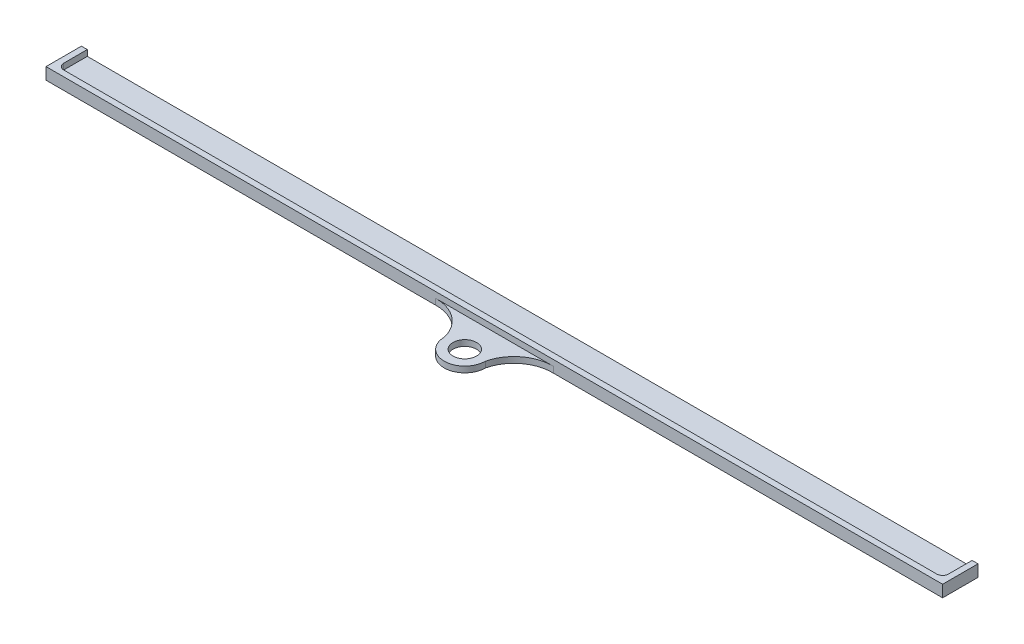
ISO-10303-21;
HEADER;
FILE_DESCRIPTION(('STEP AP214'),'2;1');
FILE_NAME('part.step','',(''),(''),'','','');
FILE_SCHEMA(('AUTOMOTIVE_DESIGN { 1 0 10303 214 1 1 1 1 }'));
ENDSEC;
DATA;
#1=APPLICATION_CONTEXT('core data for automotive mechanical design processes');
#2=APPLICATION_PROTOCOL_DEFINITION('international standard','automotive_design',2000,#1);
#3=PRODUCT_CONTEXT('',#1,'mechanical');
#4=PRODUCT('Part','Part','',(#3));
#5=PRODUCT_RELATED_PRODUCT_CATEGORY('part','',(#4));
#6=PRODUCT_DEFINITION_FORMATION('','',#4);
#7=PRODUCT_DEFINITION_CONTEXT('part definition',#1,'design');
#8=PRODUCT_DEFINITION('design','',#6,#7);
#9=PRODUCT_DEFINITION_SHAPE('','',#8);
#10=(LENGTH_UNIT() NAMED_UNIT(*) SI_UNIT(.MILLI.,.METRE.));
#11=(NAMED_UNIT(*) PLANE_ANGLE_UNIT() SI_UNIT($,.RADIAN.));
#12=(NAMED_UNIT(*) SI_UNIT($,.STERADIAN.) SOLID_ANGLE_UNIT());
#13=UNCERTAINTY_MEASURE_WITH_UNIT(LENGTH_MEASURE(1.E-05),#10,'distance_accuracy_value','');
#14=(GEOMETRIC_REPRESENTATION_CONTEXT(3) GLOBAL_UNCERTAINTY_ASSIGNED_CONTEXT((#13)) GLOBAL_UNIT_ASSIGNED_CONTEXT((#10,
#11,#12)) REPRESENTATION_CONTEXT('',''));
#15=CARTESIAN_POINT('',(0.,0.,0.));
#16=DIRECTION('',(0.,0.,1.));
#17=DIRECTION('',(1.,0.,0.));
#18=AXIS2_PLACEMENT_3D('',#15,#16,#17);
#19=CARTESIAN_POINT('',(0.,0.,0.));
#20=DIRECTION('',(0.,1.,0.));
#21=DIRECTION('',(0.,0.,1.));
#22=AXIS2_PLACEMENT_3D('',#19,#20,#21);
#23=PLANE('',#22);
#24=DIRECTION('',(0.,0.,-1.));
#25=VECTOR('',#24,1.);
#26=CARTESIAN_POINT('',(-150.,0.,-5.99999999999999));
#27=LINE('',#26,#25);
#28=CARTESIAN_POINT('',(-150.,0.,2.));
#29=VERTEX_POINT('',#28);
#30=CARTESIAN_POINT('',(-150.,0.,-5.99999999999999));
#31=VERTEX_POINT('',#30);
#32=EDGE_CURVE('E61',#29,#31,#27,.T.);
#33=ORIENTED_EDGE('',*,*,#32,.F.);
#34=CARTESIAN_POINT('',(-148.,0.,2.00000000000001));
#35=DIRECTION('',(0.,-1.,0.));
#36=DIRECTION('',(0.,0.,-1.));
#37=AXIS2_PLACEMENT_3D('',#34,#35,#36);
#38=CIRCLE('',#37,2.);
#39=CARTESIAN_POINT('',(-148.,0.,4.00000000000001));
#40=VERTEX_POINT('',#39);
#41=EDGE_CURVE('E65',#40,#29,#38,.T.);
#42=ORIENTED_EDGE('',*,*,#41,.F.);
#43=DIRECTION('',(-1.,0.,0.));
#44=VECTOR('',#43,1.);
#45=CARTESIAN_POINT('',(-148.,0.,4.00000000000001));
#46=LINE('',#45,#44);
#47=CARTESIAN_POINT('',(148.,0.,3.99999999999997));
#48=VERTEX_POINT('',#47);
#49=EDGE_CURVE('E353',#48,#40,#46,.T.);
#50=ORIENTED_EDGE('',*,*,#49,.F.);
#51=CARTESIAN_POINT('',(148.,0.,1.99999999999997));
#52=DIRECTION('',(0.,-1.,0.));
#53=DIRECTION('',(0.,0.,1.));
#54=AXIS2_PLACEMENT_3D('',#51,#52,#53);
#55=CIRCLE('',#54,2.);
#56=CARTESIAN_POINT('',(150.,0.,1.99999999999996));
#57=VERTEX_POINT('',#56);
#58=EDGE_CURVE('E354',#57,#48,#55,.T.);
#59=ORIENTED_EDGE('',*,*,#58,.F.);
#60=DIRECTION('',(0.,0.,1.));
#61=VECTOR('',#60,1.);
#62=CARTESIAN_POINT('',(150.,0.,-5.99999999999999));
#63=LINE('',#62,#61);
#64=CARTESIAN_POINT('',(150.,0.,-5.99999999999999));
#65=VERTEX_POINT('',#64);
#66=EDGE_CURVE('E197',#65,#57,#63,.T.);
#67=ORIENTED_EDGE('',*,*,#66,.F.);
#68=DIRECTION('',(1.,0.,0.));
#69=VECTOR('',#68,1.);
#70=CARTESIAN_POINT('',(0.,0.,-5.99999999999999));
#71=LINE('',#70,#69);
#72=EDGE_CURVE('E208',#31,#65,#71,.T.);
#73=ORIENTED_EDGE('',*,*,#72,.F.);
#74=EDGE_LOOP('',(#33,#42,#50,#59,#67,#73));
#75=FACE_BOUND('',#74,.T.);
#76=ADVANCED_FACE('F41',(#75),#23,.T.);
#77=CARTESIAN_POINT('',(-19.6502259153962,-2.,18.9952936900149));
#78=DIRECTION('',(0.,1.,0.));
#79=DIRECTION('',(0.,0.,1.));
#80=AXIS2_PLACEMENT_3D('',#77,#78,#79);
#81=CYLINDRICAL_SURFACE('',#80,13.);
#82=CARTESIAN_POINT('',(-19.9999999999999,0.,6.00000000000001));
#83=DIRECTION('',(1.,0.,0.));
#84=VECTOR('',#83,1.);
#85=LINE('',#82,#84);
#86=CARTESIAN_POINT('',(-20.,0.,6.00000000000001));
#87=VERTEX_POINT('',#86);
#88=CARTESIAN_POINT('',(-19.3004518307924,0.,6.00000000000001));
#89=VERTEX_POINT('',#88);
#90=EDGE_CURVE('E222',#87,#89,#85,.T.);
#91=ORIENTED_EDGE('',*,*,#90,.F.);
#92=DIRECTION('',(0.,1.,0.));
#93=VECTOR('',#92,1.);
#94=CARTESIAN_POINT('',(-20.,-2.,6.00000000000001));
#95=LINE('',#94,#93);
#96=CARTESIAN_POINT('',(-20.,-2.,6.00000000000001));
#97=VERTEX_POINT('',#96);
#98=EDGE_CURVE('E53',#97,#87,#95,.T.);
#99=ORIENTED_EDGE('',*,*,#98,.F.);
#100=CARTESIAN_POINT('',(-19.6502259153962,-2.,18.9952936900149));
#101=DIRECTION('',(0.,1.,0.));
#102=DIRECTION('',(0.,0.,1.));
#103=AXIS2_PLACEMENT_3D('',#100,#101,#102);
#104=CIRCLE('',#103,13.);
#105=CARTESIAN_POINT('',(-7.00000000000014,-2.,16.));
#106=VERTEX_POINT('',#105);
#107=EDGE_CURVE('E299',#97,#106,#104,.F.);
#108=ORIENTED_EDGE('',*,*,#107,.T.);
#109=DIRECTION('',(0.,1.,0.));
#110=VECTOR('',#109,1.);
#111=CARTESIAN_POINT('',(-7.00000000000014,-2.,16.));
#112=LINE('',#111,#110);
#113=CARTESIAN_POINT('',(-7.00000000000014,0.,16.));
#114=VERTEX_POINT('',#113);
#115=EDGE_CURVE('E313',#106,#114,#112,.T.);
#116=ORIENTED_EDGE('',*,*,#115,.T.);
#117=CARTESIAN_POINT('',(-19.6502259153962,0.,18.9952936900149));
#118=DIRECTION('',(0.,1.,0.));
#119=DIRECTION('',(0.,0.,1.));
#120=AXIS2_PLACEMENT_3D('',#117,#118,#119);
#121=CIRCLE('',#120,13.);
#122=EDGE_CURVE('E234',#89,#114,#121,.F.);
#123=ORIENTED_EDGE('',*,*,#122,.F.);
#124=EDGE_LOOP('',(#91,#99,#108,#116,#123));
#125=FACE_BOUND('',#124,.T.);
#126=ADVANCED_FACE('F43',(#125),#81,.F.);
#127=CARTESIAN_POINT('',(0.,-2.,6.00000000000001));
#128=DIRECTION('',(0.,0.,1.));
#129=DIRECTION('',(1.,0.,0.));
#130=AXIS2_PLACEMENT_3D('',#127,#128,#129);
#131=PLANE('',#130);
#132=ORIENTED_EDGE('',*,*,#98,.T.);
#133=ORIENTED_EDGE('',*,*,#90,.T.);
#134=DIRECTION('',(1.,0.,0.));
#135=VECTOR('',#134,1.);
#136=CARTESIAN_POINT('',(-152.,0.,6.00000000000001));
#137=LINE('',#136,#135);
#138=CARTESIAN_POINT('',(19.300451830792,0.,6.00000000000001));
#139=VERTEX_POINT('',#138);
#140=EDGE_CURVE('E11',#89,#139,#137,.T.);
#141=ORIENTED_EDGE('',*,*,#140,.T.);
#142=CARTESIAN_POINT('',(19.300451830792,0.,6.00000000000001));
#143=DIRECTION('',(1.,0.,0.));
#144=VECTOR('',#143,1.);
#145=LINE('',#142,#144);
#146=CARTESIAN_POINT('',(19.9999999999999,0.,6.00000000000001));
#147=VERTEX_POINT('',#146);
#148=EDGE_CURVE('E209',#139,#147,#145,.T.);
#149=ORIENTED_EDGE('',*,*,#148,.T.);
#150=DIRECTION('',(0.,1.,0.));
#151=VECTOR('',#150,1.);
#152=CARTESIAN_POINT('',(19.9999999999999,-2.,6.00000000000001));
#153=LINE('',#152,#151);
#154=CARTESIAN_POINT('',(19.9999999999999,-2.,6.00000000000001));
#155=VERTEX_POINT('',#154);
#156=EDGE_CURVE('E212',#155,#147,#153,.T.);
#157=ORIENTED_EDGE('',*,*,#156,.F.);
#158=DIRECTION('',(1.,0.,0.));
#159=VECTOR('',#158,1.);
#160=CARTESIAN_POINT('',(0.,-2.,6.00000000000001));
#161=LINE('',#160,#159);
#162=CARTESIAN_POINT('',(152.,-2.,6.00000000000001));
#163=VERTEX_POINT('',#162);
#164=EDGE_CURVE('E330',#155,#163,#161,.T.);
#165=ORIENTED_EDGE('',*,*,#164,.T.);
#166=DIRECTION('',(0.,1.,0.));
#167=VECTOR('',#166,1.);
#168=CARTESIAN_POINT('',(152.,-2.,6.00000000000001));
#169=LINE('',#168,#167);
#170=CARTESIAN_POINT('',(152.,2.,6.00000000000001));
#171=VERTEX_POINT('',#170);
#172=EDGE_CURVE('E167',#163,#171,#169,.T.);
#173=ORIENTED_EDGE('',*,*,#172,.T.);
#174=DIRECTION('',(1.,0.,0.));
#175=VECTOR('',#174,1.);
#176=CARTESIAN_POINT('',(-152.,2.,6.00000000000001));
#177=LINE('',#176,#175);
#178=CARTESIAN_POINT('',(-152.,2.,6.00000000000001));
#179=VERTEX_POINT('',#178);
#180=EDGE_CURVE('E164',#179,#171,#177,.T.);
#181=ORIENTED_EDGE('',*,*,#180,.F.);
#182=DIRECTION('',(0.,1.,0.));
#183=VECTOR('',#182,1.);
#184=CARTESIAN_POINT('',(-152.,-2.,6.00000000000001));
#185=LINE('',#184,#183);
#186=CARTESIAN_POINT('',(-152.,-2.,6.00000000000001));
#187=VERTEX_POINT('',#186);
#188=EDGE_CURVE('E151',#187,#179,#185,.T.);
#189=ORIENTED_EDGE('',*,*,#188,.F.);
#190=EDGE_CURVE('E323',#187,#97,#161,.T.);
#191=ORIENTED_EDGE('',*,*,#190,.T.);
#192=EDGE_LOOP('',(#132,#133,#141,#149,#157,#165,#173,#181,#189,#191));
#193=FACE_BOUND('',#192,.T.);
#194=ADVANCED_FACE('F165',(#193),#131,.T.);
#195=CARTESIAN_POINT('',(-152.,-2.,0.));
#196=DIRECTION('',(1.,0.,0.));
#197=DIRECTION('',(0.,0.,-1.));
#198=AXIS2_PLACEMENT_3D('',#195,#196,#197);
#199=PLANE('',#198);
#200=ORIENTED_EDGE('',*,*,#188,.T.);
#201=DIRECTION('',(0.,0.,1.));
#202=VECTOR('',#201,1.);
#203=CARTESIAN_POINT('',(-152.,2.,-5.99999999999999));
#204=LINE('',#203,#202);
#205=CARTESIAN_POINT('',(-152.,2.,-5.99999999999999));
#206=VERTEX_POINT('',#205);
#207=EDGE_CURVE('E156',#206,#179,#204,.T.);
#208=ORIENTED_EDGE('',*,*,#207,.F.);
#209=DIRECTION('',(0.,1.,0.));
#210=VECTOR('',#209,1.);
#211=CARTESIAN_POINT('',(-152.,-2.,-5.99999999999999));
#212=LINE('',#211,#210);
#213=CARTESIAN_POINT('',(-152.,-2.,-5.99999999999999));
#214=VERTEX_POINT('',#213);
#215=EDGE_CURVE('E161',#214,#206,#212,.T.);
#216=ORIENTED_EDGE('',*,*,#215,.F.);
#217=DIRECTION('',(0.,0.,-1.));
#218=VECTOR('',#217,1.);
#219=CARTESIAN_POINT('',(-152.,-2.,0.));
#220=LINE('',#219,#218);
#221=EDGE_CURVE('E157',#187,#214,#220,.T.);
#222=ORIENTED_EDGE('',*,*,#221,.F.);
#223=EDGE_LOOP('',(#200,#208,#216,#222));
#224=FACE_BOUND('',#223,.T.);
#225=ADVANCED_FACE('F153',(#224),#199,.F.);
#226=CARTESIAN_POINT('',(0.,-2.,-5.99999999999999));
#227=DIRECTION('',(0.,0.,1.));
#228=DIRECTION('',(1.,0.,0.));
#229=AXIS2_PLACEMENT_3D('',#226,#227,#228);
#230=PLANE('',#229);
#231=ORIENTED_EDGE('',*,*,#215,.T.);
#232=DIRECTION('',(-1.,0.,0.));
#233=VECTOR('',#232,1.);
#234=CARTESIAN_POINT('',(-150.,2.,-5.99999999999999));
#235=LINE('',#234,#233);
#236=CARTESIAN_POINT('',(-150.,2.,-5.99999999999999));
#237=VERTEX_POINT('',#236);
#238=EDGE_CURVE('E176',#237,#206,#235,.T.);
#239=ORIENTED_EDGE('',*,*,#238,.F.);
#240=DIRECTION('',(0.,-1.,0.));
#241=VECTOR('',#240,1.);
#242=CARTESIAN_POINT('',(-150.,2.,-5.99999999999999));
#243=LINE('',#242,#241);
#244=EDGE_CURVE('E194',#237,#31,#243,.T.);
#245=ORIENTED_EDGE('',*,*,#244,.T.);
#246=ORIENTED_EDGE('',*,*,#72,.T.);
#247=DIRECTION('',(0.,-1.,0.));
#248=VECTOR('',#247,1.);
#249=CARTESIAN_POINT('',(150.,2.,-5.99999999999999));
#250=LINE('',#249,#248);
#251=CARTESIAN_POINT('',(150.,2.,-5.99999999999999));
#252=VERTEX_POINT('',#251);
#253=EDGE_CURVE('E236',#252,#65,#250,.T.);
#254=ORIENTED_EDGE('',*,*,#253,.F.);
#255=DIRECTION('',(-1.,0.,0.));
#256=VECTOR('',#255,1.);
#257=CARTESIAN_POINT('',(152.,2.,-5.99999999999999));
#258=LINE('',#257,#256);
#259=CARTESIAN_POINT('',(152.,2.,-5.99999999999999));
#260=VERTEX_POINT('',#259);
#261=EDGE_CURVE('E181',#260,#252,#258,.T.);
#262=ORIENTED_EDGE('',*,*,#261,.F.);
#263=DIRECTION('',(0.,1.,0.));
#264=VECTOR('',#263,1.);
#265=CARTESIAN_POINT('',(152.,-2.,-5.99999999999999));
#266=LINE('',#265,#264);
#267=CARTESIAN_POINT('',(152.,-2.,-5.99999999999999));
#268=VERTEX_POINT('',#267);
#269=EDGE_CURVE('E309',#268,#260,#266,.T.);
#270=ORIENTED_EDGE('',*,*,#269,.F.);
#271=DIRECTION('',(1.,0.,0.));
#272=VECTOR('',#271,1.);
#273=CARTESIAN_POINT('',(0.,-2.,-5.99999999999999));
#274=LINE('',#273,#272);
#275=EDGE_CURVE('E325',#214,#268,#274,.T.);
#276=ORIENTED_EDGE('',*,*,#275,.F.);
#277=EDGE_LOOP('',(#231,#239,#245,#246,#254,#262,#270,#276));
#278=FACE_BOUND('',#277,.T.);
#279=ADVANCED_FACE('F257',(#278),#230,.F.);
#280=CARTESIAN_POINT('',(152.,-2.,0.));
#281=DIRECTION('',(1.,0.,0.));
#282=DIRECTION('',(0.,0.,-1.));
#283=AXIS2_PLACEMENT_3D('',#280,#281,#282);
#284=PLANE('',#283);
#285=ORIENTED_EDGE('',*,*,#269,.T.);
#286=DIRECTION('',(0.,0.,-1.));
#287=VECTOR('',#286,1.);
#288=CARTESIAN_POINT('',(152.,2.,6.00000000000001));
#289=LINE('',#288,#287);
#290=EDGE_CURVE('E171',#171,#260,#289,.T.);
#291=ORIENTED_EDGE('',*,*,#290,.F.);
#292=ORIENTED_EDGE('',*,*,#172,.F.);
#293=DIRECTION('',(0.,0.,-1.));
#294=VECTOR('',#293,1.);
#295=CARTESIAN_POINT('',(152.,-2.,0.));
#296=LINE('',#295,#294);
#297=EDGE_CURVE('E327',#163,#268,#296,.T.);
#298=ORIENTED_EDGE('',*,*,#297,.T.);
#299=EDGE_LOOP('',(#285,#291,#292,#298));
#300=FACE_BOUND('',#299,.T.);
#301=ADVANCED_FACE('F260',(#300),#284,.T.);
#302=CARTESIAN_POINT('',(19.6502259153959,-2.,18.9952936900148));
#303=DIRECTION('',(0.,1.,0.));
#304=DIRECTION('',(0.,0.,1.));
#305=AXIS2_PLACEMENT_3D('',#302,#303,#304);
#306=CYLINDRICAL_SURFACE('',#305,13.);
#307=CARTESIAN_POINT('',(19.6502259153959,0.,18.9952936900148));
#308=DIRECTION('',(0.,1.,0.));
#309=DIRECTION('',(0.,0.,1.));
#310=AXIS2_PLACEMENT_3D('',#307,#308,#309);
#311=CIRCLE('',#310,13.);
#312=CARTESIAN_POINT('',(6.99999999999986,0.,16.));
#313=VERTEX_POINT('',#312);
#314=EDGE_CURVE('E205',#313,#139,#311,.F.);
#315=ORIENTED_EDGE('',*,*,#314,.F.);
#316=DIRECTION('',(0.,1.,0.));
#317=VECTOR('',#316,1.);
#318=CARTESIAN_POINT('',(6.99999999999986,-2.,16.));
#319=LINE('',#318,#317);
#320=CARTESIAN_POINT('',(6.99999999999986,-2.,16.));
#321=VERTEX_POINT('',#320);
#322=EDGE_CURVE('E214',#321,#313,#319,.T.);
#323=ORIENTED_EDGE('',*,*,#322,.F.);
#324=CARTESIAN_POINT('',(19.6502259153959,-2.,18.9952936900148));
#325=DIRECTION('',(0.,1.,0.));
#326=DIRECTION('',(0.,0.,1.));
#327=AXIS2_PLACEMENT_3D('',#324,#325,#326);
#328=CIRCLE('',#327,13.);
#329=EDGE_CURVE('E332',#321,#155,#328,.F.);
#330=ORIENTED_EDGE('',*,*,#329,.T.);
#331=ORIENTED_EDGE('',*,*,#156,.T.);
#332=ORIENTED_EDGE('',*,*,#148,.F.);
#333=EDGE_LOOP('',(#315,#323,#330,#331,#332));
#334=FACE_BOUND('',#333,.T.);
#335=ADVANCED_FACE('F263',(#334),#306,.F.);
#336=CARTESIAN_POINT('',(-1.35308431126191E-13,-2.,16.));
#337=DIRECTION('',(0.,1.,0.));
#338=DIRECTION('',(0.,0.,1.));
#339=AXIS2_PLACEMENT_3D('',#336,#337,#338);
#340=CYLINDRICAL_SURFACE('',#339,7.);
#341=CARTESIAN_POINT('',(-1.35308431126191E-13,0.,16.));
#342=DIRECTION('',(0.,1.,0.));
#343=DIRECTION('',(0.,0.,1.));
#344=AXIS2_PLACEMENT_3D('',#341,#342,#343);
#345=CIRCLE('',#344,7.);
#346=EDGE_CURVE('E319',#114,#313,#345,.T.);
#347=ORIENTED_EDGE('',*,*,#346,.F.);
#348=ORIENTED_EDGE('',*,*,#115,.F.);
#349=CARTESIAN_POINT('',(-1.35308431126191E-13,-2.,16.));
#350=DIRECTION('',(0.,1.,0.));
#351=DIRECTION('',(0.,0.,1.));
#352=AXIS2_PLACEMENT_3D('',#349,#350,#351);
#353=CIRCLE('',#352,7.);
#354=EDGE_CURVE('E302',#106,#321,#353,.T.);
#355=ORIENTED_EDGE('',*,*,#354,.T.);
#356=ORIENTED_EDGE('',*,*,#322,.T.);
#357=EDGE_LOOP('',(#347,#348,#355,#356));
#358=FACE_BOUND('',#357,.T.);
#359=ADVANCED_FACE('F267',(#358),#340,.T.);
#360=CARTESIAN_POINT('',(-1.35308431126191E-13,-2.,16.));
#361=DIRECTION('',(0.,1.,0.));
#362=DIRECTION('',(0.,0.,1.));
#363=AXIS2_PLACEMENT_3D('',#360,#361,#362);
#364=CYLINDRICAL_SURFACE('',#363,4.);
#365=CARTESIAN_POINT('',(-1.35308431126191E-13,-2.,16.));
#366=DIRECTION('',(0.,1.,0.));
#367=DIRECTION('',(0.,0.,1.));
#368=AXIS2_PLACEMENT_3D('',#365,#366,#367);
#369=CIRCLE('',#368,4.);
#370=CARTESIAN_POINT('',(-1.35308431126191E-13,-2.,20.));
#371=VERTEX_POINT('',#370);
#372=EDGE_CURVE('E315',#371,#371,#369,.T.);
#373=ORIENTED_EDGE('',*,*,#372,.F.);
#374=EDGE_LOOP('',(#373));
#375=FACE_BOUND('',#374,.T.);
#376=CARTESIAN_POINT('',(-1.35308431126191E-13,0.,16.));
#377=DIRECTION('',(0.,1.,0.));
#378=DIRECTION('',(0.,0.,1.));
#379=AXIS2_PLACEMENT_3D('',#376,#377,#378);
#380=CIRCLE('',#379,4.);
#381=CARTESIAN_POINT('',(-1.35308431126191E-13,0.,20.));
#382=VERTEX_POINT('',#381);
#383=EDGE_CURVE('E297',#382,#382,#380,.T.);
#384=ORIENTED_EDGE('',*,*,#383,.T.);
#385=EDGE_LOOP('',(#384));
#386=FACE_BOUND('',#385,.T.);
#387=ADVANCED_FACE('F252',(#375,#386),#364,.F.);
#388=CARTESIAN_POINT('',(0.,-2.,0.));
#389=DIRECTION('',(0.,1.,0.));
#390=DIRECTION('',(0.,0.,1.));
#391=AXIS2_PLACEMENT_3D('',#388,#389,#390);
#392=PLANE('',#391);
#393=ORIENTED_EDGE('',*,*,#107,.F.);
#394=ORIENTED_EDGE('',*,*,#190,.F.);
#395=ORIENTED_EDGE('',*,*,#221,.T.);
#396=ORIENTED_EDGE('',*,*,#275,.T.);
#397=ORIENTED_EDGE('',*,*,#297,.F.);
#398=ORIENTED_EDGE('',*,*,#164,.F.);
#399=ORIENTED_EDGE('',*,*,#329,.F.);
#400=ORIENTED_EDGE('',*,*,#354,.F.);
#401=EDGE_LOOP('',(#393,#394,#395,#396,#397,#398,#399,#400));
#402=FACE_BOUND('',#401,.T.);
#403=ORIENTED_EDGE('',*,*,#372,.T.);
#404=EDGE_LOOP('',(#403));
#405=FACE_BOUND('',#404,.T.);
#406=ADVANCED_FACE('F274',(#402,#405),#392,.F.);
#407=ORIENTED_EDGE('',*,*,#140,.F.);
#408=ORIENTED_EDGE('',*,*,#122,.T.);
#409=ORIENTED_EDGE('',*,*,#346,.T.);
#410=ORIENTED_EDGE('',*,*,#314,.T.);
#411=EDGE_LOOP('',(#407,#408,#409,#410));
#412=FACE_BOUND('',#411,.T.);
#413=ORIENTED_EDGE('',*,*,#383,.F.);
#414=EDGE_LOOP('',(#413));
#415=FACE_BOUND('',#414,.T.);
#416=ADVANCED_FACE('F278',(#412,#415),#23,.T.);
#417=CARTESIAN_POINT('',(150.,2.,-5.99999999999999));
#418=DIRECTION('',(1.,0.,0.));
#419=DIRECTION('',(0.,0.,-1.));
#420=AXIS2_PLACEMENT_3D('',#417,#418,#419);
#421=PLANE('',#420);
#422=ORIENTED_EDGE('',*,*,#66,.T.);
#423=DIRECTION('',(0.,-1.,0.));
#424=VECTOR('',#423,1.);
#425=CARTESIAN_POINT('',(150.,2.,1.99999999999996));
#426=LINE('',#425,#424);
#427=CARTESIAN_POINT('',(150.,2.,1.99999999999996));
#428=VERTEX_POINT('',#427);
#429=EDGE_CURVE('E338',#428,#57,#426,.T.);
#430=ORIENTED_EDGE('',*,*,#429,.F.);
#431=DIRECTION('',(0.,0.,1.));
#432=VECTOR('',#431,1.);
#433=CARTESIAN_POINT('',(150.,2.,-5.99999999999999));
#434=LINE('',#433,#432);
#435=EDGE_CURVE('E183',#252,#428,#434,.T.);
#436=ORIENTED_EDGE('',*,*,#435,.F.);
#437=ORIENTED_EDGE('',*,*,#253,.T.);
#438=EDGE_LOOP('',(#422,#430,#436,#437));
#439=FACE_BOUND('',#438,.T.);
#440=ADVANCED_FACE('F285',(#439),#421,.F.);
#441=CARTESIAN_POINT('',(148.,2.,1.99999999999997));
#442=DIRECTION('',(0.,-1.,0.));
#443=DIRECTION('',(0.,0.,-1.));
#444=AXIS2_PLACEMENT_3D('',#441,#442,#443);
#445=CYLINDRICAL_SURFACE('',#444,2.);
#446=ORIENTED_EDGE('',*,*,#58,.T.);
#447=DIRECTION('',(0.,-1.,0.));
#448=VECTOR('',#447,1.);
#449=CARTESIAN_POINT('',(148.,2.,3.99999999999997));
#450=LINE('',#449,#448);
#451=CARTESIAN_POINT('',(148.,2.,3.99999999999997));
#452=VERTEX_POINT('',#451);
#453=EDGE_CURVE('E341',#452,#48,#450,.T.);
#454=ORIENTED_EDGE('',*,*,#453,.F.);
#455=CARTESIAN_POINT('',(148.,2.,1.99999999999997));
#456=DIRECTION('',(0.,-1.,0.));
#457=DIRECTION('',(0.,0.,1.));
#458=AXIS2_PLACEMENT_3D('',#455,#456,#457);
#459=CIRCLE('',#458,2.);
#460=EDGE_CURVE('E185',#428,#452,#459,.T.);
#461=ORIENTED_EDGE('',*,*,#460,.F.);
#462=ORIENTED_EDGE('',*,*,#429,.T.);
#463=EDGE_LOOP('',(#446,#454,#461,#462));
#464=FACE_BOUND('',#463,.T.);
#465=ADVANCED_FACE('F290',(#464),#445,.F.);
#466=CARTESIAN_POINT('',(-148.,2.,4.00000000000001));
#467=DIRECTION('',(0.,0.,1.));
#468=DIRECTION('',(1.,0.,0.));
#469=AXIS2_PLACEMENT_3D('',#466,#467,#468);
#470=PLANE('',#469);
#471=ORIENTED_EDGE('',*,*,#49,.T.);
#472=DIRECTION('',(0.,-1.,0.));
#473=VECTOR('',#472,1.);
#474=CARTESIAN_POINT('',(-148.,2.,4.00000000000001));
#475=LINE('',#474,#473);
#476=CARTESIAN_POINT('',(-148.,2.,4.00000000000001));
#477=VERTEX_POINT('',#476);
#478=EDGE_CURVE('E344',#477,#40,#475,.T.);
#479=ORIENTED_EDGE('',*,*,#478,.F.);
#480=DIRECTION('',(-1.,0.,0.));
#481=VECTOR('',#480,1.);
#482=CARTESIAN_POINT('',(-148.,2.,4.00000000000001));
#483=LINE('',#482,#481);
#484=EDGE_CURVE('E187',#452,#477,#483,.T.);
#485=ORIENTED_EDGE('',*,*,#484,.F.);
#486=ORIENTED_EDGE('',*,*,#453,.T.);
#487=EDGE_LOOP('',(#471,#479,#485,#486));
#488=FACE_BOUND('',#487,.T.);
#489=ADVANCED_FACE('F376',(#488),#470,.F.);
#490=CARTESIAN_POINT('',(-148.,2.,2.00000000000001));
#491=DIRECTION('',(0.,-1.,0.));
#492=DIRECTION('',(0.,0.,-1.));
#493=AXIS2_PLACEMENT_3D('',#490,#491,#492);
#494=CYLINDRICAL_SURFACE('',#493,2.);
#495=ORIENTED_EDGE('',*,*,#41,.T.);
#496=DIRECTION('',(0.,-1.,0.));
#497=VECTOR('',#496,1.);
#498=CARTESIAN_POINT('',(-150.,2.,2.));
#499=LINE('',#498,#497);
#500=CARTESIAN_POINT('',(-150.,2.,2.));
#501=VERTEX_POINT('',#500);
#502=EDGE_CURVE('E347',#501,#29,#499,.T.);
#503=ORIENTED_EDGE('',*,*,#502,.F.);
#504=CARTESIAN_POINT('',(-148.,2.,2.00000000000001));
#505=DIRECTION('',(0.,-1.,0.));
#506=DIRECTION('',(0.,0.,-1.));
#507=AXIS2_PLACEMENT_3D('',#504,#505,#506);
#508=CIRCLE('',#507,2.);
#509=EDGE_CURVE('E189',#477,#501,#508,.T.);
#510=ORIENTED_EDGE('',*,*,#509,.F.);
#511=ORIENTED_EDGE('',*,*,#478,.T.);
#512=EDGE_LOOP('',(#495,#503,#510,#511));
#513=FACE_BOUND('',#512,.T.);
#514=ADVANCED_FACE('F374',(#513),#494,.F.);
#515=CARTESIAN_POINT('',(-150.,2.,-5.99999999999999));
#516=DIRECTION('',(-1.,0.,0.));
#517=DIRECTION('',(0.,0.,1.));
#518=AXIS2_PLACEMENT_3D('',#515,#516,#517);
#519=PLANE('',#518);
#520=ORIENTED_EDGE('',*,*,#32,.T.);
#521=ORIENTED_EDGE('',*,*,#244,.F.);
#522=DIRECTION('',(0.,0.,-1.));
#523=VECTOR('',#522,1.);
#524=CARTESIAN_POINT('',(-150.,2.,-5.99999999999999));
#525=LINE('',#524,#523);
#526=EDGE_CURVE('E191',#501,#237,#525,.T.);
#527=ORIENTED_EDGE('',*,*,#526,.F.);
#528=ORIENTED_EDGE('',*,*,#502,.T.);
#529=EDGE_LOOP('',(#520,#521,#527,#528));
#530=FACE_BOUND('',#529,.T.);
#531=ADVANCED_FACE('F369',(#530),#519,.F.);
#532=CARTESIAN_POINT('',(148.,2.,1.99999999999997));
#533=DIRECTION('',(0.,1.,0.));
#534=DIRECTION('',(0.,0.,1.));
#535=AXIS2_PLACEMENT_3D('',#532,#533,#534);
#536=PLANE('',#535);
#537=ORIENTED_EDGE('',*,*,#207,.T.);
#538=ORIENTED_EDGE('',*,*,#180,.T.);
#539=ORIENTED_EDGE('',*,*,#290,.T.);
#540=ORIENTED_EDGE('',*,*,#261,.T.);
#541=ORIENTED_EDGE('',*,*,#435,.T.);
#542=ORIENTED_EDGE('',*,*,#460,.T.);
#543=ORIENTED_EDGE('',*,*,#484,.T.);
#544=ORIENTED_EDGE('',*,*,#509,.T.);
#545=ORIENTED_EDGE('',*,*,#526,.T.);
#546=ORIENTED_EDGE('',*,*,#238,.T.);
#547=EDGE_LOOP('',(#537,#538,#539,#540,#541,#542,#543,#544,#545,#546));
#548=FACE_BOUND('',#547,.T.);
#549=ADVANCED_FACE('F174',(#548),#536,.T.);
#550=CLOSED_SHELL('',(#76,#126,#194,#225,#279,#301,#335,#359,#387,#406,#416,#440,#465,#489,#514,
#531,#549));
#551=MANIFOLD_SOLID_BREP('B2',#550);
#552=ADVANCED_BREP_SHAPE_REPRESENTATION('',(#18,#551),#14);
#553=SHAPE_DEFINITION_REPRESENTATION(#9,#552);
ENDSEC;
END-ISO-10303-21;
